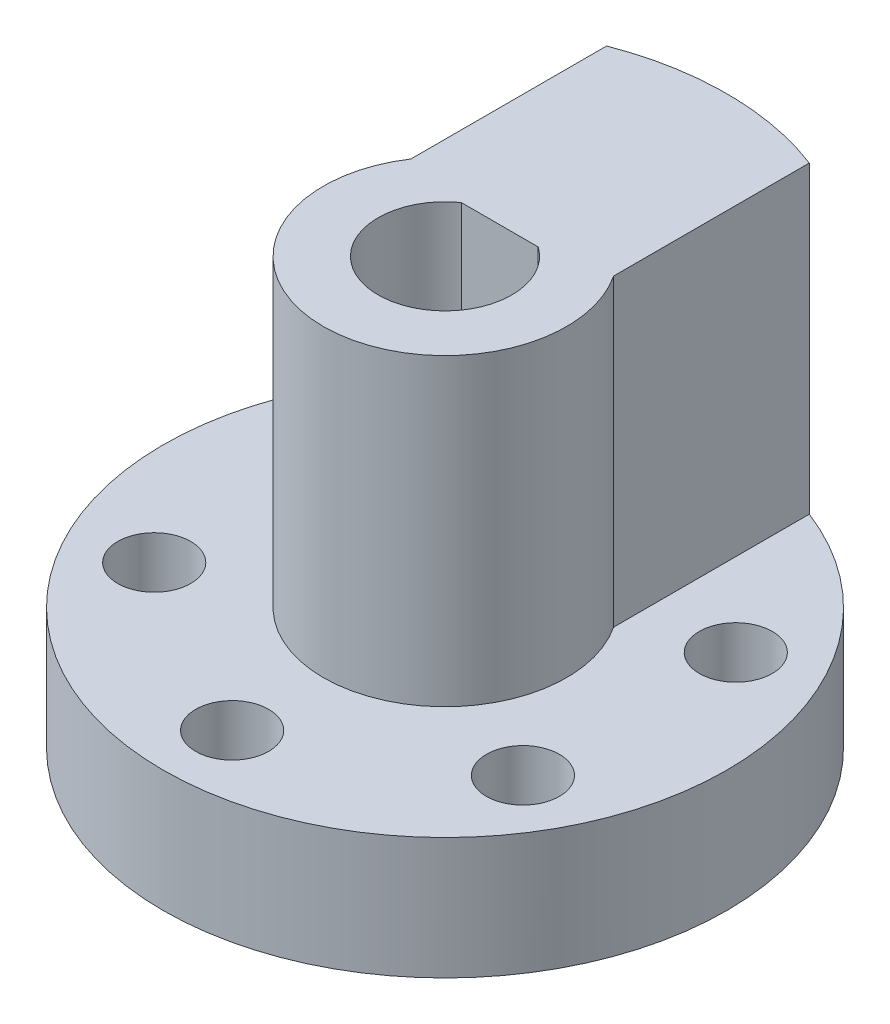
ISO-10303-21;
HEADER;
FILE_DESCRIPTION(('STEP AP214'),'2;1');
FILE_NAME('part.step','',(''),(''),'','','');
FILE_SCHEMA(('AUTOMOTIVE_DESIGN { 1 0 10303 214 1 1 1 1 }'));
ENDSEC;
DATA;
#1=APPLICATION_CONTEXT('core data for automotive mechanical design processes');
#2=APPLICATION_PROTOCOL_DEFINITION('international standard','automotive_design',2000,#1);
#3=PRODUCT_CONTEXT('',#1,'mechanical');
#4=PRODUCT('Part','Part','',(#3));
#5=PRODUCT_RELATED_PRODUCT_CATEGORY('part','',(#4));
#6=PRODUCT_DEFINITION_FORMATION('','',#4);
#7=PRODUCT_DEFINITION_CONTEXT('part definition',#1,'design');
#8=PRODUCT_DEFINITION('design','',#6,#7);
#9=PRODUCT_DEFINITION_SHAPE('','',#8);
#10=(LENGTH_UNIT() NAMED_UNIT(*) SI_UNIT(.MILLI.,.METRE.));
#11=(NAMED_UNIT(*) PLANE_ANGLE_UNIT() SI_UNIT($,.RADIAN.));
#12=(NAMED_UNIT(*) SI_UNIT($,.STERADIAN.) SOLID_ANGLE_UNIT());
#13=UNCERTAINTY_MEASURE_WITH_UNIT(LENGTH_MEASURE(1.E-05),#10,'distance_accuracy_value','');
#14=(GEOMETRIC_REPRESENTATION_CONTEXT(3) GLOBAL_UNCERTAINTY_ASSIGNED_CONTEXT((#13)) GLOBAL_UNIT_ASSIGNED_CONTEXT((#10,
#11,#12)) REPRESENTATION_CONTEXT('',''));
#15=CARTESIAN_POINT('',(0.,0.,0.));
#16=DIRECTION('',(0.,0.,1.));
#17=DIRECTION('',(1.,0.,0.));
#18=AXIS2_PLACEMENT_3D('',#15,#16,#17);
#19=CARTESIAN_POINT('',(-5.,21.,-13.901));
#20=DIRECTION('',(1.,0.,0.));
#21=DIRECTION('',(0.,1.,0.));
#22=AXIS2_PLACEMENT_3D('',#19,#20,#21);
#23=PLANE('',#22);
#24=DIRECTION('',(0.,0.,1.));
#25=VECTOR('',#24,1.);
#26=CARTESIAN_POINT('',(-5.,6.,-13.901));
#27=LINE('',#26,#25);
#28=CARTESIAN_POINT('',(-5.,6.,-12.9695797927304));
#29=VERTEX_POINT('',#28);
#30=CARTESIAN_POINT('',(-5.,6.,-3.3166247903554));
#31=VERTEX_POINT('',#30);
#32=EDGE_CURVE('E215',#29,#31,#27,.T.);
#33=ORIENTED_EDGE('',*,*,#32,.T.);
#34=DIRECTION('',(0.,-1.,0.));
#35=VECTOR('',#34,1.);
#36=CARTESIAN_POINT('',(-5.,21.,-3.3166247903554));
#37=LINE('',#36,#35);
#38=CARTESIAN_POINT('',(-5.,21.,-3.3166247903554));
#39=VERTEX_POINT('',#38);
#40=EDGE_CURVE('E226',#31,#39,#37,.F.);
#41=ORIENTED_EDGE('',*,*,#40,.T.);
#42=DIRECTION('',(0.,0.,1.));
#43=VECTOR('',#42,1.);
#44=CARTESIAN_POINT('',(-5.,21.,-13.901));
#45=LINE('',#44,#43);
#46=CARTESIAN_POINT('',(-5.,21.,-12.9695797927304));
#47=VERTEX_POINT('',#46);
#48=EDGE_CURVE('E220',#47,#39,#45,.T.);
#49=ORIENTED_EDGE('',*,*,#48,.F.);
#50=DIRECTION('',(0.,-1.,0.));
#51=VECTOR('',#50,1.);
#52=CARTESIAN_POINT('',(-5.,6.,-12.9695797927304));
#53=LINE('',#52,#51);
#54=EDGE_CURVE('E223',#47,#29,#53,.T.);
#55=ORIENTED_EDGE('',*,*,#54,.T.);
#56=EDGE_LOOP('',(#33,#41,#49,#55));
#57=FACE_BOUND('',#56,.T.);
#58=DIRECTION('',(0.,1.,0.));
#59=VECTOR('',#58,1.);
#60=CARTESIAN_POINT('',(-5.,16.3576567461745,-5.4));
#61=LINE('',#60,#59);
#62=CARTESIAN_POINT('',(-5.,9.05706259227168,-5.4));
#63=VERTEX_POINT('',#62);
#64=CARTESIAN_POINT('',(-5.,16.3576567461745,-5.4));
#65=VERTEX_POINT('',#64);
#66=EDGE_CURVE('E149',#63,#65,#61,.T.);
#67=ORIENTED_EDGE('',*,*,#66,.F.);
#68=DIRECTION('',(0.,0.,-1.));
#69=VECTOR('',#68,1.);
#70=CARTESIAN_POINT('',(-5.,9.05706259227168,-5.4));
#71=LINE('',#70,#69);
#72=CARTESIAN_POINT('',(-5.,9.05706259227168,-8.9));
#73=VERTEX_POINT('',#72);
#74=EDGE_CURVE('E131',#63,#73,#71,.T.);
#75=ORIENTED_EDGE('',*,*,#74,.T.);
#76=DIRECTION('',(0.,1.,0.));
#77=VECTOR('',#76,1.);
#78=CARTESIAN_POINT('',(-5.,16.3576567461745,-8.9));
#79=LINE('',#78,#77);
#80=CARTESIAN_POINT('',(-5.,16.3576567461745,-8.9));
#81=VERTEX_POINT('',#80);
#82=EDGE_CURVE('E160',#73,#81,#79,.T.);
#83=ORIENTED_EDGE('',*,*,#82,.T.);
#84=DIRECTION('',(0.,0.,-1.));
#85=VECTOR('',#84,1.);
#86=CARTESIAN_POINT('',(-5.,16.3576567461745,-5.4));
#87=LINE('',#86,#85);
#88=EDGE_CURVE('E51',#65,#81,#87,.T.);
#89=ORIENTED_EDGE('',*,*,#88,.F.);
#90=EDGE_LOOP('',(#67,#75,#83,#89));
#91=FACE_BOUND('',#90,.T.);
#92=ADVANCED_FACE('F33',(#57,#91),#23,.F.);
#93=CARTESIAN_POINT('',(0.,12.7073596692231,0.100000000000001));
#94=DIRECTION('',(0.,0.,-1.));
#95=DIRECTION('',(-1.,0.,0.));
#96=AXIS2_PLACEMENT_3D('',#93,#94,#95);
#97=CYLINDRICAL_SURFACE('',#96,2.2);
#98=CARTESIAN_POINT('',(-1.89736659610103,11.5938067966571,-2.7));
#99=CARTESIAN_POINT('',(-1.94895706573654,11.6816795596956,-2.66375823248252));
#100=CARTESIAN_POINT('',(-1.9949011660353,11.7739967045069,-2.6292377766464));
#101=CARTESIAN_POINT('',(-2.07433871185283,11.9670178680902,-2.56703848830963));
#102=CARTESIAN_POINT('',(-2.10771464372792,12.0677907684943,-2.53942500263767));
#103=CARTESIAN_POINT('',(-2.16005107221954,12.276332533738,-2.4950736082829));
#104=CARTESIAN_POINT('',(-2.17890350059118,12.3841474901948,-2.47841736278203));
#105=CARTESIAN_POINT('',(-2.20018646208004,12.6021190644112,-2.45955497101669));
#106=CARTESIAN_POINT('',(-2.20270761515323,12.7122593520717,-2.45726908771989));
#107=CARTESIAN_POINT('',(-2.1920871930454,12.9168579265506,-2.46673217006012));
#108=CARTESIAN_POINT('',(-2.18091418582132,13.0115147540793,-2.47671760831416));
#109=CARTESIAN_POINT('',(-2.14680364690595,13.1974706155262,-2.50633951542001));
#110=CARTESIAN_POINT('',(-2.12381832466438,13.288754381989,-2.52601517563037));
#111=CARTESIAN_POINT('',(-2.07030518762728,13.456163241086,-2.56999770020758));
#112=CARTESIAN_POINT('',(-2.04088290226123,13.5328521375963,-2.59355866878389));
#113=CARTESIAN_POINT('',(-1.97454838901886,13.6808425109771,-2.64440959047464));
#114=CARTESIAN_POINT('',(-1.93769681866134,13.7521815787871,-2.67166879422839));
#115=CARTESIAN_POINT('',(-1.89736659610103,13.8209125417891,-2.7));
#116=B_SPLINE_CURVE_WITH_KNOTS('',3,(#98,#99,#100,#101,#102,#103,#104,#105,#106,#107,#108,#109,
#110,#111,#112,#113,#114,#115),.UNSPECIFIED.,.F.,.F.,(4,2,2,2,2,2,2,2,4),(0.,0.324740911180947,
0.652446936766245,0.982568454942557,1.31085659449531,1.59701355218507,1.88433747333165,
2.14010748209387,2.39386813969871),.UNSPECIFIED.);
#117=CARTESIAN_POINT('',(-1.89736659610103,11.5938067966571,-2.7));
#118=VERTEX_POINT('',#117);
#119=CARTESIAN_POINT('',(-1.89736659610103,13.8209125417891,-2.7));
#120=VERTEX_POINT('',#119);
#121=EDGE_CURVE('E59',#118,#120,#116,.T.);
#122=ORIENTED_EDGE('',*,*,#121,.F.);
#123=CARTESIAN_POINT('',(0.,12.7073596692231,-2.7));
#124=DIRECTION('',(0.,0.,-1.));
#125=DIRECTION('',(-1.,0.,0.));
#126=AXIS2_PLACEMENT_3D('',#123,#124,#125);
#127=CIRCLE('',#126,2.2);
#128=CARTESIAN_POINT('',(1.89736659610103,11.5938067966571,-2.7));
#129=VERTEX_POINT('',#128);
#130=EDGE_CURVE('E43',#129,#118,#127,.T.);
#131=ORIENTED_EDGE('',*,*,#130,.F.);
#132=CARTESIAN_POINT('',(1.89736659610103,13.8209125417891,-2.7));
#133=CARTESIAN_POINT('',(1.94895706573654,13.7330397787505,-2.66375823248252));
#134=CARTESIAN_POINT('',(1.9949011660353,13.6407226339393,-2.6292377766464));
#135=CARTESIAN_POINT('',(2.07433871185284,13.447701470356,-2.56703848830963));
#136=CARTESIAN_POINT('',(2.10771464372792,13.3469285699519,-2.53942500263766));
#137=CARTESIAN_POINT('',(2.16005107221954,13.1383868047082,-2.4950736082829));
#138=CARTESIAN_POINT('',(2.17890350059118,13.0305718482514,-2.47841736278203));
#139=CARTESIAN_POINT('',(2.20018646208004,12.812600274035,-2.45955497101669));
#140=CARTESIAN_POINT('',(2.20270761515323,12.7024599863745,-2.45726908771989));
#141=CARTESIAN_POINT('',(2.1920871930454,12.4978614118956,-2.46673217006012));
#142=CARTESIAN_POINT('',(2.18091418582132,12.4032045843669,-2.47671760831416));
#143=CARTESIAN_POINT('',(2.14680364690595,12.21724872292,-2.50633951542001));
#144=CARTESIAN_POINT('',(2.12381832466438,12.1259649564572,-2.52601517563037));
#145=CARTESIAN_POINT('',(2.07030518762728,11.9585560973602,-2.56999770020758));
#146=CARTESIAN_POINT('',(2.04088290226123,11.8818672008499,-2.59355866878388));
#147=CARTESIAN_POINT('',(1.97454838901886,11.7338768274691,-2.64440959047463));
#148=CARTESIAN_POINT('',(1.93769681866135,11.6625377596591,-2.67166879422838));
#149=CARTESIAN_POINT('',(1.89736659610103,11.5938067966571,-2.7));
#150=B_SPLINE_CURVE_WITH_KNOTS('',3,(#132,#133,#134,#135,#136,#137,#138,#139,#140,#141,#142,
#143,#144,#145,#146,#147,#148,#149),.UNSPECIFIED.,.F.,.F.,(4,2,2,2,2,2,2,2,4),(0.,
0.324740911180947,0.652446936766241,0.982568454942557,1.3108565944953,1.59701355218507,
1.88433747333165,2.14010748209386,2.3938681396987),.UNSPECIFIED.);
#151=CARTESIAN_POINT('',(1.89736659610103,13.8209125417891,-2.7));
#152=VERTEX_POINT('',#151);
#153=EDGE_CURVE('E186',#152,#129,#150,.T.);
#154=ORIENTED_EDGE('',*,*,#153,.F.);
#155=EDGE_CURVE('E11',#120,#152,#127,.T.);
#156=ORIENTED_EDGE('',*,*,#155,.F.);
#157=EDGE_LOOP('',(#122,#131,#154,#156));
#158=FACE_BOUND('',#157,.T.);
#159=CARTESIAN_POINT('',(0.,12.7073596692231,-5.4));
#160=DIRECTION('',(0.,0.,-1.));
#161=DIRECTION('',(-1.,0.,0.));
#162=AXIS2_PLACEMENT_3D('',#159,#160,#161);
#163=CIRCLE('',#162,2.2);
#164=CARTESIAN_POINT('',(-2.2,12.7073596692231,-5.4));
#165=VERTEX_POINT('',#164);
#166=EDGE_CURVE('E38',#165,#165,#163,.F.);
#167=ORIENTED_EDGE('',*,*,#166,.F.);
#168=EDGE_LOOP('',(#167));
#169=FACE_BOUND('',#168,.T.);
#170=ADVANCED_FACE('F203',(#158,#169),#97,.F.);
#171=CARTESIAN_POINT('',(-1.89736659610103,9.2,-2.7));
#172=DIRECTION('',(0.,0.,-1.));
#173=DIRECTION('',(-1.,0.,0.));
#174=AXIS2_PLACEMENT_3D('',#171,#172,#173);
#175=PLANE('',#174);
#176=DIRECTION('',(0.,1.,0.));
#177=VECTOR('',#176,1.);
#178=CARTESIAN_POINT('',(-1.89736659610103,9.2,-2.7));
#179=LINE('',#178,#177);
#180=CARTESIAN_POINT('',(-1.89736659610103,21.,-2.7));
#181=VERTEX_POINT('',#180);
#182=EDGE_CURVE('E261',#120,#181,#179,.T.);
#183=ORIENTED_EDGE('',*,*,#182,.F.);
#184=ORIENTED_EDGE('',*,*,#155,.T.);
#185=DIRECTION('',(0.,1.,0.));
#186=VECTOR('',#185,1.);
#187=CARTESIAN_POINT('',(1.89736659610103,9.2,-2.7));
#188=LINE('',#187,#186);
#189=CARTESIAN_POINT('',(1.89736659610103,21.,-2.7));
#190=VERTEX_POINT('',#189);
#191=EDGE_CURVE('E252',#152,#190,#188,.T.);
#192=ORIENTED_EDGE('',*,*,#191,.T.);
#193=DIRECTION('',(-1.,0.,0.));
#194=VECTOR('',#193,1.);
#195=CARTESIAN_POINT('',(-1.89736659610103,21.,-2.7));
#196=LINE('',#195,#194);
#197=EDGE_CURVE('E249',#190,#181,#196,.T.);
#198=ORIENTED_EDGE('',*,*,#197,.T.);
#199=EDGE_LOOP('',(#183,#184,#192,#198));
#200=FACE_BOUND('',#199,.T.);
#201=ADVANCED_FACE('F313',(#200),#175,.F.);
#202=CARTESIAN_POINT('',(0.,6.,0.));
#203=DIRECTION('',(0.,1.,0.));
#204=DIRECTION('',(0.,0.,1.));
#205=AXIS2_PLACEMENT_3D('',#202,#203,#204);
#206=PLANE('',#205);
#207=CARTESIAN_POINT('',(-9.0932667397365,6.,-5.24999999999989));
#208=DIRECTION('',(0.,1.,0.));
#209=DIRECTION('',(0.,0.,1.));
#210=AXIS2_PLACEMENT_3D('',#207,#208,#209);
#211=CIRCLE('',#210,1.8);
#212=CARTESIAN_POINT('',(-9.0932667397365,6.,-3.44999999999989));
#213=VERTEX_POINT('',#212);
#214=EDGE_CURVE('E271',#213,#213,#211,.T.);
#215=ORIENTED_EDGE('',*,*,#214,.F.);
#216=EDGE_LOOP('',(#215));
#217=FACE_BOUND('',#216,.T.);
#218=CARTESIAN_POINT('',(2.83627288322208E-13,6.,10.4999999999999));
#219=DIRECTION('',(0.,1.,0.));
#220=DIRECTION('',(0.,0.,1.));
#221=AXIS2_PLACEMENT_3D('',#218,#219,#220);
#222=CIRCLE('',#221,1.8);
#223=CARTESIAN_POINT('',(2.83627288322208E-13,6.,12.2999999999999));
#224=VERTEX_POINT('',#223);
#225=EDGE_CURVE('E283',#224,#224,#222,.T.);
#226=ORIENTED_EDGE('',*,*,#225,.F.);
#227=EDGE_LOOP('',(#226));
#228=FACE_BOUND('',#227,.T.);
#229=CARTESIAN_POINT('',(9.09326673973664,6.,-5.25000000000015));
#230=DIRECTION('',(0.,1.,0.));
#231=DIRECTION('',(0.,0.,1.));
#232=AXIS2_PLACEMENT_3D('',#229,#230,#231);
#233=CIRCLE('',#232,1.8);
#234=CARTESIAN_POINT('',(9.09326673973664,6.,-3.45000000000015));
#235=VERTEX_POINT('',#234);
#236=EDGE_CURVE('E295',#235,#235,#233,.T.);
#237=ORIENTED_EDGE('',*,*,#236,.F.);
#238=EDGE_LOOP('',(#237));
#239=FACE_BOUND('',#238,.T.);
#240=CARTESIAN_POINT('',(9.09326673973678,6.,5.24999999999982));
#241=DIRECTION('',(0.,1.,0.));
#242=DIRECTION('',(0.,0.,1.));
#243=AXIS2_PLACEMENT_3D('',#240,#241,#242);
#244=CIRCLE('',#243,1.8);
#245=CARTESIAN_POINT('',(9.09326673973678,6.,7.04999999999982));
#246=VERTEX_POINT('',#245);
#247=EDGE_CURVE('E289',#246,#246,#244,.T.);
#248=ORIENTED_EDGE('',*,*,#247,.F.);
#249=EDGE_LOOP('',(#248));
#250=FACE_BOUND('',#249,.T.);
#251=CARTESIAN_POINT('',(-9.09326673973636,6.,5.25000000000007));
#252=DIRECTION('',(0.,1.,0.));
#253=DIRECTION('',(0.,0.,1.));
#254=AXIS2_PLACEMENT_3D('',#251,#252,#253);
#255=CIRCLE('',#254,1.8);
#256=CARTESIAN_POINT('',(-9.09326673973636,6.,7.05000000000007));
#257=VERTEX_POINT('',#256);
#258=EDGE_CURVE('E277',#257,#257,#255,.T.);
#259=ORIENTED_EDGE('',*,*,#258,.F.);
#260=EDGE_LOOP('',(#259));
#261=FACE_BOUND('',#260,.T.);
#262=CARTESIAN_POINT('',(0.,6.,0.));
#263=DIRECTION('',(0.,1.,0.));
#264=DIRECTION('',(0.,0.,1.));
#265=AXIS2_PLACEMENT_3D('',#262,#263,#264);
#266=CIRCLE('',#265,13.9);
#267=CARTESIAN_POINT('',(5.,6.,-12.9695797927304));
#268=VERTEX_POINT('',#267);
#269=EDGE_CURVE('E304',#29,#268,#266,.T.);
#270=ORIENTED_EDGE('',*,*,#269,.T.);
#271=DIRECTION('',(0.,0.,1.));
#272=VECTOR('',#271,1.);
#273=CARTESIAN_POINT('',(5.,6.,-13.901));
#274=LINE('',#273,#272);
#275=CARTESIAN_POINT('',(5.,6.,-3.3166247903554));
#276=VERTEX_POINT('',#275);
#277=EDGE_CURVE('E229',#268,#276,#274,.T.);
#278=ORIENTED_EDGE('',*,*,#277,.T.);
#279=CARTESIAN_POINT('',(0.,6.,0.));
#280=DIRECTION('',(0.,1.,0.));
#281=DIRECTION('',(0.,0.,1.));
#282=AXIS2_PLACEMENT_3D('',#279,#280,#281);
#283=CIRCLE('',#282,6.);
#284=EDGE_CURVE('E260',#31,#276,#283,.T.);
#285=ORIENTED_EDGE('',*,*,#284,.F.);
#286=ORIENTED_EDGE('',*,*,#32,.F.);
#287=EDGE_LOOP('',(#270,#278,#285,#286));
#288=FACE_BOUND('',#287,.T.);
#289=ADVANCED_FACE('F318',(#217,#228,#239,#250,#261,#288),#206,.T.);
#290=CARTESIAN_POINT('',(0.,21.,0.));
#291=DIRECTION('',(0.,-1.,0.));
#292=DIRECTION('',(0.,0.,-1.));
#293=AXIS2_PLACEMENT_3D('',#290,#291,#292);
#294=CYLINDRICAL_SURFACE('',#293,6.);
#295=DIRECTION('',(0.,-1.,0.));
#296=VECTOR('',#295,1.);
#297=CARTESIAN_POINT('',(5.,21.,-3.3166247903554));
#298=LINE('',#297,#296);
#299=CARTESIAN_POINT('',(5.,21.,-3.3166247903554));
#300=VERTEX_POINT('',#299);
#301=EDGE_CURVE('E238',#300,#276,#298,.T.);
#302=ORIENTED_EDGE('',*,*,#301,.F.);
#303=CARTESIAN_POINT('',(0.,21.,0.));
#304=DIRECTION('',(0.,1.,0.));
#305=DIRECTION('',(0.,0.,1.));
#306=AXIS2_PLACEMENT_3D('',#303,#304,#305);
#307=CIRCLE('',#306,6.);
#308=EDGE_CURVE('E265',#39,#300,#307,.T.);
#309=ORIENTED_EDGE('',*,*,#308,.F.);
#310=ORIENTED_EDGE('',*,*,#40,.F.);
#311=ORIENTED_EDGE('',*,*,#284,.T.);
#312=EDGE_LOOP('',(#302,#309,#310,#311));
#313=FACE_BOUND('',#312,.T.);
#314=ADVANCED_FACE('F355',(#313),#294,.T.);
#315=CARTESIAN_POINT('',(0.,0.,0.));
#316=DIRECTION('',(0.,1.,0.));
#317=DIRECTION('',(0.,0.,1.));
#318=AXIS2_PLACEMENT_3D('',#315,#316,#317);
#319=PLANE('',#318);
#320=CARTESIAN_POINT('',(0.,0.,0.));
#321=DIRECTION('',(0.,1.,0.));
#322=DIRECTION('',(0.,0.,1.));
#323=AXIS2_PLACEMENT_3D('',#320,#321,#322);
#324=CIRCLE('',#323,13.9);
#325=CARTESIAN_POINT('',(0.,0.,13.9));
#326=VERTEX_POINT('',#325);
#327=EDGE_CURVE('E303',#326,#326,#324,.T.);
#328=ORIENTED_EDGE('',*,*,#327,.F.);
#329=EDGE_LOOP('',(#328));
#330=FACE_BOUND('',#329,.T.);
#331=CARTESIAN_POINT('',(0.,0.,-10.5));
#332=DIRECTION('',(0.,1.,0.));
#333=DIRECTION('',(0.,0.,1.));
#334=AXIS2_PLACEMENT_3D('',#331,#332,#333);
#335=CIRCLE('',#334,1.8);
#336=CARTESIAN_POINT('',(0.,0.,-8.7));
#337=VERTEX_POINT('',#336);
#338=EDGE_CURVE('E298',#337,#337,#335,.T.);
#339=ORIENTED_EDGE('',*,*,#338,.T.);
#340=EDGE_LOOP('',(#339));
#341=FACE_BOUND('',#340,.T.);
#342=CARTESIAN_POINT('',(9.09326673973664,0.,-5.25000000000015));
#343=DIRECTION('',(0.,1.,0.));
#344=DIRECTION('',(0.,0.,1.));
#345=AXIS2_PLACEMENT_3D('',#342,#343,#344);
#346=CIRCLE('',#345,1.8);
#347=CARTESIAN_POINT('',(9.09326673973664,0.,-3.45000000000015));
#348=VERTEX_POINT('',#347);
#349=EDGE_CURVE('E292',#348,#348,#346,.T.);
#350=ORIENTED_EDGE('',*,*,#349,.T.);
#351=EDGE_LOOP('',(#350));
#352=FACE_BOUND('',#351,.T.);
#353=CARTESIAN_POINT('',(9.09326673973678,0.,5.24999999999982));
#354=DIRECTION('',(0.,1.,0.));
#355=DIRECTION('',(0.,0.,1.));
#356=AXIS2_PLACEMENT_3D('',#353,#354,#355);
#357=CIRCLE('',#356,1.8);
#358=CARTESIAN_POINT('',(9.09326673973678,0.,7.04999999999982));
#359=VERTEX_POINT('',#358);
#360=EDGE_CURVE('E286',#359,#359,#357,.T.);
#361=ORIENTED_EDGE('',*,*,#360,.T.);
#362=EDGE_LOOP('',(#361));
#363=FACE_BOUND('',#362,.T.);
#364=CARTESIAN_POINT('',(2.83627288322208E-13,0.,10.4999999999999));
#365=DIRECTION('',(0.,1.,0.));
#366=DIRECTION('',(0.,0.,1.));
#367=AXIS2_PLACEMENT_3D('',#364,#365,#366);
#368=CIRCLE('',#367,1.8);
#369=CARTESIAN_POINT('',(2.83627288322208E-13,0.,12.2999999999999));
#370=VERTEX_POINT('',#369);
#371=EDGE_CURVE('E280',#370,#370,#368,.T.);
#372=ORIENTED_EDGE('',*,*,#371,.T.);
#373=EDGE_LOOP('',(#372));
#374=FACE_BOUND('',#373,.T.);
#375=CARTESIAN_POINT('',(-9.09326673973636,0.,5.25000000000007));
#376=DIRECTION('',(0.,1.,0.));
#377=DIRECTION('',(0.,0.,1.));
#378=AXIS2_PLACEMENT_3D('',#375,#376,#377);
#379=CIRCLE('',#378,1.8);
#380=CARTESIAN_POINT('',(-9.09326673973636,0.,7.05000000000007));
#381=VERTEX_POINT('',#380);
#382=EDGE_CURVE('E274',#381,#381,#379,.T.);
#383=ORIENTED_EDGE('',*,*,#382,.T.);
#384=EDGE_LOOP('',(#383));
#385=FACE_BOUND('',#384,.T.);
#386=CARTESIAN_POINT('',(-9.0932667397365,0.,-5.24999999999989));
#387=DIRECTION('',(0.,1.,0.));
#388=DIRECTION('',(0.,0.,1.));
#389=AXIS2_PLACEMENT_3D('',#386,#387,#388);
#390=CIRCLE('',#389,1.8);
#391=CARTESIAN_POINT('',(-9.0932667397365,0.,-3.44999999999989));
#392=VERTEX_POINT('',#391);
#393=EDGE_CURVE('E268',#392,#392,#390,.T.);
#394=ORIENTED_EDGE('',*,*,#393,.T.);
#395=EDGE_LOOP('',(#394));
#396=FACE_BOUND('',#395,.T.);
#397=ADVANCED_FACE('F357',(#330,#341,#352,#363,#374,#385,#396),#319,.F.);
#398=CARTESIAN_POINT('',(0.,6.,0.));
#399=DIRECTION('',(0.,-1.,0.));
#400=DIRECTION('',(0.,0.,-1.));
#401=AXIS2_PLACEMENT_3D('',#398,#399,#400);
#402=CYLINDRICAL_SURFACE('',#401,13.9);
#403=CARTESIAN_POINT('',(0.,14.9073596692231,-13.9));
#404=CARTESIAN_POINT('',(-0.122752587292723,14.9073546723194,-13.8999979612803));
#405=CARTESIAN_POINT('',(-0.245574357552858,14.8970512030796,-13.8983569442898));
#406=CARTESIAN_POINT('',(-0.487779178076391,14.8561232328444,-13.8919685785411));
#407=CARTESIAN_POINT('',(-0.607158858135367,14.8254794772272,-13.887218286525));
#408=CARTESIAN_POINT('',(-0.838939735741254,14.7448142947678,-13.875144704741));
#409=CARTESIAN_POINT('',(-0.951346338031819,14.694808098852,-13.8678234377795));
#410=CARTESIAN_POINT('',(-1.16615747194565,14.5768760584678,-13.8514149646535));
#411=CARTESIAN_POINT('',(-1.26856327135833,14.5089524894136,-13.8423279827644));
#412=CARTESIAN_POINT('',(-1.46136839797584,14.3564876382785,-13.8233090760439));
#413=CARTESIAN_POINT('',(-1.55166856974417,14.271821700648,-13.8133711510469));
#414=CARTESIAN_POINT('',(-1.71684315677369,14.0885437628017,-13.7938168822805));
#415=CARTESIAN_POINT('',(-1.79171664387752,13.9899309240623,-13.7842005578895));
#416=CARTESIAN_POINT('',(-1.92430403746543,13.7808849191001,-13.766320138006));
#417=CARTESIAN_POINT('',(-1.98192097485189,13.6703895292592,-13.7580637971373));
#418=CARTESIAN_POINT('',(-2.07773985007578,13.4411368067097,-13.7439207495492));
#419=CARTESIAN_POINT('',(-2.11594296781623,13.322379976601,-13.7380338988252));
#420=CARTESIAN_POINT('',(-2.17153962468481,13.0810223703056,-13.7293557284874));
#421=CARTESIAN_POINT('',(-2.18910362915803,12.9584617889293,-13.7265390653957));
#422=CARTESIAN_POINT('',(-2.20345178318249,12.7121031079266,-13.7242433822765));
#423=CARTESIAN_POINT('',(-2.20023725959459,12.5883050878237,-13.7247641491295));
#424=CARTESIAN_POINT('',(-2.17325869105765,12.3441960016169,-13.7290613276348));
#425=CARTESIAN_POINT('',(-2.14968529122246,12.2238632570156,-13.7328075345426));
#426=CARTESIAN_POINT('',(-2.08295693192942,11.9888827826908,-13.7430862604769));
#427=CARTESIAN_POINT('',(-2.03980136135993,11.8742352305121,-13.7496188664597));
#428=CARTESIAN_POINT('',(-1.93493782872182,11.65330402614,-13.7647673396571));
#429=CARTESIAN_POINT('',(-1.87314988322,11.5470589763629,-13.7733921562744));
#430=CARTESIAN_POINT('',(-1.73283241024162,11.3463726554586,-13.7917469093493));
#431=CARTESIAN_POINT('',(-1.65430166162627,11.251932246102,-13.8014769263907));
#432=CARTESIAN_POINT('',(-1.48168504932234,11.076431768777,-13.8210788547836));
#433=CARTESIAN_POINT('',(-1.38743543785303,10.9955327127754,-13.830951138208));
#434=CARTESIAN_POINT('',(-1.18661251478727,10.850674731686,-13.8496246712459));
#435=CARTESIAN_POINT('',(-1.08003913757237,10.7867158968031,-13.8584259151562));
#436=CARTESIAN_POINT('',(-0.857448628579366,10.6775425620138,-13.873976453569));
#437=CARTESIAN_POINT('',(-0.741424868827404,10.6323413554626,-13.8807242919423));
#438=CARTESIAN_POINT('',(-0.503302348085182,10.5621109113537,-13.8913957956524));
#439=CARTESIAN_POINT('',(-0.381204045587977,10.5370801538201,-13.8953196737908));
#440=CARTESIAN_POINT('',(-0.135787099225626,10.5081172566453,-13.899872750554));
#441=CARTESIAN_POINT('',(-0.012495178285339,10.5039639152831,-13.9005364894836));
#442=CARTESIAN_POINT('',(0.233023693482207,10.5162853556753,-13.8985888056412));
#443=CARTESIAN_POINT('',(0.355250680989348,10.5327594241016,-13.8959774961254));
#444=CARTESIAN_POINT('',(0.594493686562085,10.5856840784253,-13.8877944930587));
#445=CARTESIAN_POINT('',(0.711534329753619,10.6220260514887,-13.8822389001709));
#446=CARTESIAN_POINT('',(0.937861468832596,10.7135397595923,-13.8687879908059));
#447=CARTESIAN_POINT('',(1.04714756511337,10.7687124641661,-13.8608925538605));
#448=CARTESIAN_POINT('',(1.25583033465021,10.8968344647375,-13.843552824553));
#449=CARTESIAN_POINT('',(1.35514048435355,10.9699230429038,-13.8340965960959));
#450=CARTESIAN_POINT('',(1.54016465207149,11.1316092849388,-13.8147226947028));
#451=CARTESIAN_POINT('',(1.62587778432999,11.2202079583979,-13.8048049917591));
#452=CARTESIAN_POINT('',(1.78208702458562,11.4113877510281,-13.7855153525727));
#453=CARTESIAN_POINT('',(1.85243427597145,11.5140911889826,-13.7761493464829));
#454=CARTESIAN_POINT('',(1.97487779106474,11.7299871515998,-13.7591313376945));
#455=CARTESIAN_POINT('',(2.02697459056041,11.8431793682145,-13.7514792846808));
#456=CARTESIAN_POINT('',(2.11121154743649,12.0764092985592,-13.7387992773224));
#457=CARTESIAN_POINT('',(2.14342798443106,12.1964188929941,-13.7337613049265));
#458=CARTESIAN_POINT('',(2.18723121353187,12.4402317392931,-13.7268539639921));
#459=CARTESIAN_POINT('',(2.19881960720114,12.5640346958811,-13.7249843494626));
#460=CARTESIAN_POINT('',(2.20099650979174,12.8104349787564,-13.7246352868429));
#461=CARTESIAN_POINT('',(2.19181918641741,12.9330302462649,-13.726118035182));
#462=CARTESIAN_POINT('',(2.15322916989118,13.1749096785358,-13.7322241363882));
#463=CARTESIAN_POINT('',(2.12381652450417,13.2941938511132,-13.7368474818419));
#464=CARTESIAN_POINT('',(2.04567696171656,13.5259877168225,-13.748700067606));
#465=CARTESIAN_POINT('',(1.99696825399439,13.6385036821266,-13.7559268504735));
#466=CARTESIAN_POINT('',(1.88164286034423,13.853804601202,-13.7721747157937));
#467=CARTESIAN_POINT('',(1.81502543059573,13.9565891505491,-13.7811958727699));
#468=CARTESIAN_POINT('',(1.66493007710248,14.1506961337415,-13.8001367631327));
#469=CARTESIAN_POINT('',(1.5812792622838,14.2418840570527,-13.8100650835198));
#470=CARTESIAN_POINT('',(1.39985690670413,14.4090100514121,-13.8296314982808));
#471=CARTESIAN_POINT('',(1.30208210088828,14.484944586592,-13.839269524923));
#472=CARTESIAN_POINT('',(1.09447346420826,14.619831939999,-13.8572378671309));
#473=CARTESIAN_POINT('',(0.984568938910175,14.6786770697668,-13.8655597455764));
#474=CARTESIAN_POINT('',(0.756352222084404,14.7769819563835,-13.879875800164));
#475=CARTESIAN_POINT('',(0.638048718125699,14.8164614192979,-13.8858723412098));
#476=CARTESIAN_POINT('',(0.432706761554538,14.8661445147527,-13.8935222809494));
#477=CARTESIAN_POINT('',(0.346923987057856,14.8815760339741,-13.8959387054439));
#478=CARTESIAN_POINT('',(0.174105732100947,14.9021853083628,-13.8991782763571));
#479=CARTESIAN_POINT('',(0.0870702699939157,14.9073632136026,-13.9000014460947));
#480=CARTESIAN_POINT('',(0.,14.9073596692231,-13.9));
#481=B_SPLINE_CURVE_WITH_KNOTS('',3,(#403,#404,#405,#406,#407,#408,#409,#410,#411,#412,#413,
#414,#415,#416,#417,#418,#419,#420,#421,#422,#423,#424,#425,#426,#427,#428,#429,#430,#431,#432,
#433,#434,#435,#436,#437,#438,#439,#440,#441,#442,#443,#444,#445,#446,#447,#448,#449,#450,#451,
#452,#453,#454,#455,#456,#457,#458,#459,#460,#461,#462,#463,#464,#465,#466,#467,#468,#469,#470,
#471,#472,#473,#474,#475,#476,#477,#478,#479,#480),.UNSPECIFIED.,.T.,.F.,(4,2,2,2,2,2,2,2,2,2,2,
2,2,2,2,2,2,2,2,2,2,2,2,2,2,2,2,2,2,2,2,2,2,2,2,2,2,2,4),(0.,0.367939548481127,
0.736227895381582,1.10422712510375,1.47217964329658,1.84298256266491,2.21380778514203,
2.58667927809266,2.95952810652699,3.32927531022948,3.69899890310405,4.06529740402449,
4.43160733701123,4.79951267587044,5.16744485714479,5.53948138505512,5.91151989398171,
6.28382161468708,6.65609527738747,7.02441616345942,7.39272431277052,7.75903886040876,
8.12537227124892,8.49464937219241,8.86395051923615,9.23668451840376,9.60940757410441,
9.98069147665469,10.3519465514339,10.7190360039012,11.0861245898676,11.4528675767259,
11.8196257982342,12.1903109660056,12.5610819629198,12.9341410415102,13.3068197120041,
13.5678086282805,13.8287937246785),.UNSPECIFIED.);
#482=CARTESIAN_POINT('',(0.,14.9073596692231,-13.9));
#483=VERTEX_POINT('',#482);
#484=EDGE_CURVE('E209',#483,#483,#481,.T.);
#485=ORIENTED_EDGE('',*,*,#484,.T.);
#486=EDGE_LOOP('',(#485));
#487=FACE_BOUND('',#486,.T.);
#488=ORIENTED_EDGE('',*,*,#269,.F.);
#489=ORIENTED_EDGE('',*,*,#54,.F.);
#490=CARTESIAN_POINT('',(0.,21.,0.));
#491=DIRECTION('',(0.,-1.,0.));
#492=DIRECTION('',(0.,0.,-1.));
#493=AXIS2_PLACEMENT_3D('',#490,#491,#492);
#494=CIRCLE('',#493,13.9);
#495=CARTESIAN_POINT('',(5.,21.,-12.9695797927304));
#496=VERTEX_POINT('',#495);
#497=EDGE_CURVE('E219',#496,#47,#494,.F.);
#498=ORIENTED_EDGE('',*,*,#497,.F.);
#499=DIRECTION('',(0.,-1.,0.));
#500=VECTOR('',#499,1.);
#501=CARTESIAN_POINT('',(5.,6.,-12.9695797927304));
#502=LINE('',#501,#500);
#503=EDGE_CURVE('E216',#268,#496,#502,.F.);
#504=ORIENTED_EDGE('',*,*,#503,.F.);
#505=EDGE_LOOP('',(#488,#489,#498,#504));
#506=FACE_BOUND('',#505,.T.);
#507=ORIENTED_EDGE('',*,*,#327,.T.);
#508=EDGE_LOOP('',(#507));
#509=FACE_BOUND('',#508,.T.);
#510=ADVANCED_FACE('F35',(#487,#506,#509),#402,.T.);
#511=CARTESIAN_POINT('',(0.,6.,-10.5));
#512=DIRECTION('',(0.,-1.,0.));
#513=DIRECTION('',(0.,0.,-1.));
#514=AXIS2_PLACEMENT_3D('',#511,#512,#513);
#515=CYLINDRICAL_SURFACE('',#514,1.8);
#516=CARTESIAN_POINT('',(0.,6.,-10.5));
#517=DIRECTION('',(0.,1.,0.));
#518=DIRECTION('',(0.,0.,1.));
#519=AXIS2_PLACEMENT_3D('',#516,#517,#518);
#520=CIRCLE('',#519,1.8);
#521=CARTESIAN_POINT('',(0.,6.,-8.7));
#522=VERTEX_POINT('',#521);
#523=EDGE_CURVE('E241',#522,#522,#520,.T.);
#524=ORIENTED_EDGE('',*,*,#523,.T.);
#525=EDGE_LOOP('',(#524));
#526=FACE_BOUND('',#525,.T.);
#527=ORIENTED_EDGE('',*,*,#338,.F.);
#528=EDGE_LOOP('',(#527));
#529=FACE_BOUND('',#528,.T.);
#530=ADVANCED_FACE('F374',(#526,#529),#515,.F.);
#531=CARTESIAN_POINT('',(9.09326673973664,6.,-5.25000000000015));
#532=DIRECTION('',(0.,-1.,0.));
#533=DIRECTION('',(0.,0.,-1.));
#534=AXIS2_PLACEMENT_3D('',#531,#532,#533);
#535=CYLINDRICAL_SURFACE('',#534,1.8);
#536=ORIENTED_EDGE('',*,*,#236,.T.);
#537=EDGE_LOOP('',(#536));
#538=FACE_BOUND('',#537,.T.);
#539=ORIENTED_EDGE('',*,*,#349,.F.);
#540=EDGE_LOOP('',(#539));
#541=FACE_BOUND('',#540,.T.);
#542=ADVANCED_FACE('F370',(#538,#541),#535,.F.);
#543=CARTESIAN_POINT('',(9.09326673973678,6.,5.24999999999982));
#544=DIRECTION('',(0.,-1.,0.));
#545=DIRECTION('',(0.,0.,-1.));
#546=AXIS2_PLACEMENT_3D('',#543,#544,#545);
#547=CYLINDRICAL_SURFACE('',#546,1.8);
#548=ORIENTED_EDGE('',*,*,#247,.T.);
#549=EDGE_LOOP('',(#548));
#550=FACE_BOUND('',#549,.T.);
#551=ORIENTED_EDGE('',*,*,#360,.F.);
#552=EDGE_LOOP('',(#551));
#553=FACE_BOUND('',#552,.T.);
#554=ADVANCED_FACE('F366',(#550,#553),#547,.F.);
#555=CARTESIAN_POINT('',(2.83627288322208E-13,6.,10.4999999999999));
#556=DIRECTION('',(0.,-1.,0.));
#557=DIRECTION('',(0.,0.,-1.));
#558=AXIS2_PLACEMENT_3D('',#555,#556,#557);
#559=CYLINDRICAL_SURFACE('',#558,1.8);
#560=ORIENTED_EDGE('',*,*,#225,.T.);
#561=EDGE_LOOP('',(#560));
#562=FACE_BOUND('',#561,.T.);
#563=ORIENTED_EDGE('',*,*,#371,.F.);
#564=EDGE_LOOP('',(#563));
#565=FACE_BOUND('',#564,.T.);
#566=ADVANCED_FACE('F362',(#562,#565),#559,.F.);
#567=CARTESIAN_POINT('',(-9.09326673973636,6.,5.25000000000007));
#568=DIRECTION('',(0.,-1.,0.));
#569=DIRECTION('',(0.,0.,-1.));
#570=AXIS2_PLACEMENT_3D('',#567,#568,#569);
#571=CYLINDRICAL_SURFACE('',#570,1.8);
#572=ORIENTED_EDGE('',*,*,#258,.T.);
#573=EDGE_LOOP('',(#572));
#574=FACE_BOUND('',#573,.T.);
#575=ORIENTED_EDGE('',*,*,#382,.F.);
#576=EDGE_LOOP('',(#575));
#577=FACE_BOUND('',#576,.T.);
#578=ADVANCED_FACE('F351',(#574,#577),#571,.F.);
#579=CARTESIAN_POINT('',(-9.0932667397365,6.,-5.24999999999989));
#580=DIRECTION('',(0.,-1.,0.));
#581=DIRECTION('',(0.,0.,-1.));
#582=AXIS2_PLACEMENT_3D('',#579,#580,#581);
#583=CYLINDRICAL_SURFACE('',#582,1.8);
#584=ORIENTED_EDGE('',*,*,#214,.T.);
#585=EDGE_LOOP('',(#584));
#586=FACE_BOUND('',#585,.T.);
#587=ORIENTED_EDGE('',*,*,#393,.F.);
#588=EDGE_LOOP('',(#587));
#589=FACE_BOUND('',#588,.T.);
#590=ADVANCED_FACE('F346',(#586,#589),#583,.F.);
#591=CARTESIAN_POINT('',(0.,21.,0.));
#592=DIRECTION('',(0.,1.,0.));
#593=DIRECTION('',(0.,0.,1.));
#594=AXIS2_PLACEMENT_3D('',#591,#592,#593);
#595=PLANE('',#594);
#596=ORIENTED_EDGE('',*,*,#308,.T.);
#597=DIRECTION('',(0.,0.,1.));
#598=VECTOR('',#597,1.);
#599=CARTESIAN_POINT('',(5.,21.,-13.901));
#600=LINE('',#599,#598);
#601=EDGE_CURVE('E231',#496,#300,#600,.T.);
#602=ORIENTED_EDGE('',*,*,#601,.F.);
#603=ORIENTED_EDGE('',*,*,#497,.T.);
#604=ORIENTED_EDGE('',*,*,#48,.T.);
#605=EDGE_LOOP('',(#596,#602,#603,#604));
#606=FACE_BOUND('',#605,.T.);
#607=CARTESIAN_POINT('',(0.,21.,0.));
#608=DIRECTION('',(0.,1.,0.));
#609=DIRECTION('',(0.,0.,1.));
#610=AXIS2_PLACEMENT_3D('',#607,#608,#609);
#611=CIRCLE('',#610,3.3);
#612=EDGE_CURVE('E244',#181,#190,#611,.T.);
#613=ORIENTED_EDGE('',*,*,#612,.F.);
#614=ORIENTED_EDGE('',*,*,#197,.F.);
#615=EDGE_LOOP('',(#613,#614));
#616=FACE_BOUND('',#615,.T.);
#617=ADVANCED_FACE('F335',(#606,#616),#595,.T.);
#618=CARTESIAN_POINT('',(0.,9.2,0.));
#619=DIRECTION('',(0.,1.,0.));
#620=DIRECTION('',(0.,0.,1.));
#621=AXIS2_PLACEMENT_3D('',#618,#619,#620);
#622=CYLINDRICAL_SURFACE('',#621,3.3);
#623=ORIENTED_EDGE('',*,*,#191,.F.);
#624=ORIENTED_EDGE('',*,*,#153,.T.);
#625=CARTESIAN_POINT('',(1.89736659610103,9.2,-2.7));
#626=VERTEX_POINT('',#625);
#627=EDGE_CURVE('E262',#626,#129,#188,.T.);
#628=ORIENTED_EDGE('',*,*,#627,.F.);
#629=CARTESIAN_POINT('',(0.,9.2,0.));
#630=DIRECTION('',(0.,1.,0.));
#631=DIRECTION('',(0.,0.,1.));
#632=AXIS2_PLACEMENT_3D('',#629,#630,#631);
#633=CIRCLE('',#632,3.3);
#634=CARTESIAN_POINT('',(-1.89736659610103,9.2,-2.7));
#635=VERTEX_POINT('',#634);
#636=EDGE_CURVE('E245',#635,#626,#633,.T.);
#637=ORIENTED_EDGE('',*,*,#636,.F.);
#638=EDGE_CURVE('E257',#635,#118,#179,.T.);
#639=ORIENTED_EDGE('',*,*,#638,.T.);
#640=ORIENTED_EDGE('',*,*,#121,.T.);
#641=ORIENTED_EDGE('',*,*,#182,.T.);
#642=ORIENTED_EDGE('',*,*,#612,.T.);
#643=EDGE_LOOP('',(#623,#624,#628,#637,#639,#640,#641,#642));
#644=FACE_BOUND('',#643,.T.);
#645=ADVANCED_FACE('F192',(#644),#622,.F.);
#646=ORIENTED_EDGE('',*,*,#627,.T.);
#647=ORIENTED_EDGE('',*,*,#130,.T.);
#648=ORIENTED_EDGE('',*,*,#638,.F.);
#649=DIRECTION('',(-1.,0.,0.));
#650=VECTOR('',#649,1.);
#651=CARTESIAN_POINT('',(-1.89736659610103,9.2,-2.7));
#652=LINE('',#651,#650);
#653=EDGE_CURVE('E248',#626,#635,#652,.T.);
#654=ORIENTED_EDGE('',*,*,#653,.F.);
#655=EDGE_LOOP('',(#646,#647,#648,#654));
#656=FACE_BOUND('',#655,.T.);
#657=ADVANCED_FACE('F320',(#656),#175,.F.);
#658=CARTESIAN_POINT('',(0.,9.2,0.));
#659=DIRECTION('',(0.,1.,0.));
#660=DIRECTION('',(0.,0.,1.));
#661=AXIS2_PLACEMENT_3D('',#658,#659,#660);
#662=PLANE('',#661);
#663=ORIENTED_EDGE('',*,*,#636,.T.);
#664=ORIENTED_EDGE('',*,*,#653,.T.);
#665=EDGE_LOOP('',(#663,#664));
#666=FACE_BOUND('',#665,.T.);
#667=ADVANCED_FACE('F327',(#666),#662,.T.);
#668=CARTESIAN_POINT('',(5.,21.,-13.901));
#669=DIRECTION('',(-1.,0.,0.));
#670=DIRECTION('',(0.,-1.,0.));
#671=AXIS2_PLACEMENT_3D('',#668,#669,#670);
#672=PLANE('',#671);
#673=ORIENTED_EDGE('',*,*,#601,.T.);
#674=ORIENTED_EDGE('',*,*,#301,.T.);
#675=ORIENTED_EDGE('',*,*,#277,.F.);
#676=ORIENTED_EDGE('',*,*,#503,.T.);
#677=EDGE_LOOP('',(#673,#674,#675,#676));
#678=FACE_BOUND('',#677,.T.);
#679=ADVANCED_FACE('F326',(#678),#672,.F.);
#680=CARTESIAN_POINT('',(5.,6.,-13.901));
#681=DIRECTION('',(0.,1.,0.));
#682=DIRECTION('',(0.,0.,1.));
#683=AXIS2_PLACEMENT_3D('',#680,#681,#682);
#684=PLANE('',#683);
#685=ORIENTED_EDGE('',*,*,#523,.F.);
#686=EDGE_LOOP('',(#685));
#687=FACE_BOUND('',#686,.T.);
#688=ADVANCED_FACE('F201',(#687),#684,.F.);
#689=CARTESIAN_POINT('',(0.,12.7073596692231,-8.9));
#690=DIRECTION('',(0.,0.,-1.));
#691=DIRECTION('',(-1.,0.,0.));
#692=AXIS2_PLACEMENT_3D('',#689,#690,#691);
#693=CIRCLE('',#692,2.2);
#694=CARTESIAN_POINT('',(-2.2,12.7073596692231,-8.9));
#695=VERTEX_POINT('',#694);
#696=EDGE_CURVE('E173',#695,#695,#693,.F.);
#697=ORIENTED_EDGE('',*,*,#696,.T.);
#698=EDGE_LOOP('',(#697));
#699=FACE_BOUND('',#698,.T.);
#700=ORIENTED_EDGE('',*,*,#484,.F.);
#701=EDGE_LOOP('',(#700));
#702=FACE_BOUND('',#701,.T.);
#703=ADVANCED_FACE('F196',(#699,#702),#97,.F.);
#704=CARTESIAN_POINT('',(0.,0.,-5.4));
#705=DIRECTION('',(0.,0.,-1.));
#706=DIRECTION('',(-1.,0.,0.));
#707=AXIS2_PLACEMENT_3D('',#704,#705,#706);
#708=PLANE('',#707);
#709=DIRECTION('',(-1.,0.,0.));
#710=VECTOR('',#709,1.);
#711=CARTESIAN_POINT('',(-5.,9.05706259227168,-5.4));
#712=LINE('',#711,#710);
#713=CARTESIAN_POINT('',(2.1075,9.05706259227169,-5.4));
#714=VERTEX_POINT('',#713);
#715=EDGE_CURVE('E134',#714,#63,#712,.T.);
#716=ORIENTED_EDGE('',*,*,#715,.T.);
#717=ORIENTED_EDGE('',*,*,#66,.T.);
#718=DIRECTION('',(1.,0.,0.));
#719=VECTOR('',#718,1.);
#720=CARTESIAN_POINT('',(0.,16.3576567461745,-5.4));
#721=LINE('',#720,#719);
#722=CARTESIAN_POINT('',(2.1075,16.3576567461745,-5.4));
#723=VERTEX_POINT('',#722);
#724=EDGE_CURVE('E153',#65,#723,#721,.T.);
#725=ORIENTED_EDGE('',*,*,#724,.T.);
#726=DIRECTION('',(0.5,-0.866025403784439,0.));
#727=VECTOR('',#726,1.);
#728=CARTESIAN_POINT('',(2.1075,16.3576567461745,-5.4));
#729=LINE('',#728,#727);
#730=CARTESIAN_POINT('',(4.215,12.7073596692231,-5.4));
#731=VERTEX_POINT('',#730);
#732=EDGE_CURVE('E155',#723,#731,#729,.T.);
#733=ORIENTED_EDGE('',*,*,#732,.T.);
#734=DIRECTION('',(-0.5,-0.866025403784439,0.));
#735=VECTOR('',#734,1.);
#736=CARTESIAN_POINT('',(4.215,12.7073596692231,-5.4));
#737=LINE('',#736,#735);
#738=EDGE_CURVE('E142',#731,#714,#737,.T.);
#739=ORIENTED_EDGE('',*,*,#738,.T.);
#740=EDGE_LOOP('',(#716,#717,#725,#733,#739));
#741=FACE_BOUND('',#740,.T.);
#742=ORIENTED_EDGE('',*,*,#166,.T.);
#743=EDGE_LOOP('',(#742));
#744=FACE_BOUND('',#743,.T.);
#745=ADVANCED_FACE('F147',(#741,#744),#708,.T.);
#746=CARTESIAN_POINT('',(0.,0.,-8.9));
#747=DIRECTION('',(0.,0.,-1.));
#748=DIRECTION('',(-1.,0.,0.));
#749=AXIS2_PLACEMENT_3D('',#746,#747,#748);
#750=PLANE('',#749);
#751=DIRECTION('',(-1.,0.,0.));
#752=VECTOR('',#751,1.);
#753=CARTESIAN_POINT('',(2.1075,9.05706259227169,-8.9));
#754=LINE('',#753,#752);
#755=CARTESIAN_POINT('',(2.1075,9.05706259227169,-8.9));
#756=VERTEX_POINT('',#755);
#757=EDGE_CURVE('E137',#756,#73,#754,.T.);
#758=ORIENTED_EDGE('',*,*,#757,.F.);
#759=DIRECTION('',(-0.5,-0.866025403784439,0.));
#760=VECTOR('',#759,1.);
#761=CARTESIAN_POINT('',(4.215,12.7073596692231,-8.9));
#762=LINE('',#761,#760);
#763=CARTESIAN_POINT('',(4.215,12.7073596692231,-8.9));
#764=VERTEX_POINT('',#763);
#765=EDGE_CURVE('E167',#764,#756,#762,.T.);
#766=ORIENTED_EDGE('',*,*,#765,.F.);
#767=DIRECTION('',(0.5,-0.866025403784439,0.));
#768=VECTOR('',#767,1.);
#769=CARTESIAN_POINT('',(2.1075,16.3576567461745,-8.9));
#770=LINE('',#769,#768);
#771=CARTESIAN_POINT('',(2.1075,16.3576567461745,-8.9));
#772=VERTEX_POINT('',#771);
#773=EDGE_CURVE('E164',#772,#764,#770,.T.);
#774=ORIENTED_EDGE('',*,*,#773,.F.);
#775=DIRECTION('',(1.,0.,0.));
#776=VECTOR('',#775,1.);
#777=CARTESIAN_POINT('',(0.,16.3576567461745,-8.9));
#778=LINE('',#777,#776);
#779=EDGE_CURVE('E162',#81,#772,#778,.T.);
#780=ORIENTED_EDGE('',*,*,#779,.F.);
#781=ORIENTED_EDGE('',*,*,#82,.F.);
#782=EDGE_LOOP('',(#758,#766,#774,#780,#781));
#783=FACE_BOUND('',#782,.T.);
#784=ORIENTED_EDGE('',*,*,#696,.F.);
#785=EDGE_LOOP('',(#784));
#786=FACE_BOUND('',#785,.T.);
#787=ADVANCED_FACE('F438',(#783,#786),#750,.F.);
#788=CARTESIAN_POINT('',(2.1075,9.05706259227169,-5.4));
#789=DIRECTION('',(0.,-1.,0.));
#790=DIRECTION('',(0.,0.,-1.));
#791=AXIS2_PLACEMENT_3D('',#788,#789,#790);
#792=PLANE('',#791);
#793=ORIENTED_EDGE('',*,*,#757,.T.);
#794=ORIENTED_EDGE('',*,*,#74,.F.);
#795=ORIENTED_EDGE('',*,*,#715,.F.);
#796=DIRECTION('',(0.,0.,-1.));
#797=VECTOR('',#796,1.);
#798=CARTESIAN_POINT('',(2.1075,9.05706259227169,-5.4));
#799=LINE('',#798,#797);
#800=EDGE_CURVE('E171',#714,#756,#799,.T.);
#801=ORIENTED_EDGE('',*,*,#800,.T.);
#802=EDGE_LOOP('',(#793,#794,#795,#801));
#803=FACE_BOUND('',#802,.T.);
#804=ADVANCED_FACE('F133',(#803),#792,.F.);
#805=CARTESIAN_POINT('',(4.215,12.7073596692231,-5.4));
#806=DIRECTION('',(0.866025403784439,-0.5,0.));
#807=DIRECTION('',(0.5,0.866025403784439,0.));
#808=AXIS2_PLACEMENT_3D('',#805,#806,#807);
#809=PLANE('',#808);
#810=ORIENTED_EDGE('',*,*,#765,.T.);
#811=ORIENTED_EDGE('',*,*,#800,.F.);
#812=ORIENTED_EDGE('',*,*,#738,.F.);
#813=DIRECTION('',(0.,0.,-1.));
#814=VECTOR('',#813,1.);
#815=CARTESIAN_POINT('',(4.215,12.7073596692231,-5.4));
#816=LINE('',#815,#814);
#817=EDGE_CURVE('E174',#731,#764,#816,.T.);
#818=ORIENTED_EDGE('',*,*,#817,.T.);
#819=EDGE_LOOP('',(#810,#811,#812,#818));
#820=FACE_BOUND('',#819,.T.);
#821=ADVANCED_FACE('F452',(#820),#809,.F.);
#822=CARTESIAN_POINT('',(2.1075,16.3576567461745,-5.4));
#823=DIRECTION('',(0.866025403784438,0.5,0.));
#824=DIRECTION('',(-0.5,0.866025403784439,0.));
#825=AXIS2_PLACEMENT_3D('',#822,#823,#824);
#826=PLANE('',#825);
#827=ORIENTED_EDGE('',*,*,#773,.T.);
#828=ORIENTED_EDGE('',*,*,#817,.F.);
#829=ORIENTED_EDGE('',*,*,#732,.F.);
#830=DIRECTION('',(0.,0.,-1.));
#831=VECTOR('',#830,1.);
#832=CARTESIAN_POINT('',(2.1075,16.3576567461745,-5.4));
#833=LINE('',#832,#831);
#834=EDGE_CURVE('E176',#723,#772,#833,.T.);
#835=ORIENTED_EDGE('',*,*,#834,.T.);
#836=EDGE_LOOP('',(#827,#828,#829,#835));
#837=FACE_BOUND('',#836,.T.);
#838=ADVANCED_FACE('F459',(#837),#826,.F.);
#839=CARTESIAN_POINT('',(0.,16.3576567461745,-5.4));
#840=DIRECTION('',(0.,1.,0.));
#841=DIRECTION('',(0.,0.,1.));
#842=AXIS2_PLACEMENT_3D('',#839,#840,#841);
#843=PLANE('',#842);
#844=ORIENTED_EDGE('',*,*,#779,.T.);
#845=ORIENTED_EDGE('',*,*,#834,.F.);
#846=ORIENTED_EDGE('',*,*,#724,.F.);
#847=ORIENTED_EDGE('',*,*,#88,.T.);
#848=EDGE_LOOP('',(#844,#845,#846,#847));
#849=FACE_BOUND('',#848,.T.);
#850=ADVANCED_FACE('F204',(#849),#843,.F.);
#851=CLOSED_SHELL('',(#92,#170,#201,#289,#314,#397,#510,#530,#542,#554,#566,#578,#590,#617,#645,
#657,#667,#679,#688,#703,#745,#787,#804,#821,#838,#850));
#852=MANIFOLD_SOLID_BREP('B2',#851);
#853=ADVANCED_BREP_SHAPE_REPRESENTATION('',(#18,#852),#14);
#854=SHAPE_DEFINITION_REPRESENTATION(#9,#853);
ENDSEC;
END-ISO-10303-21;
